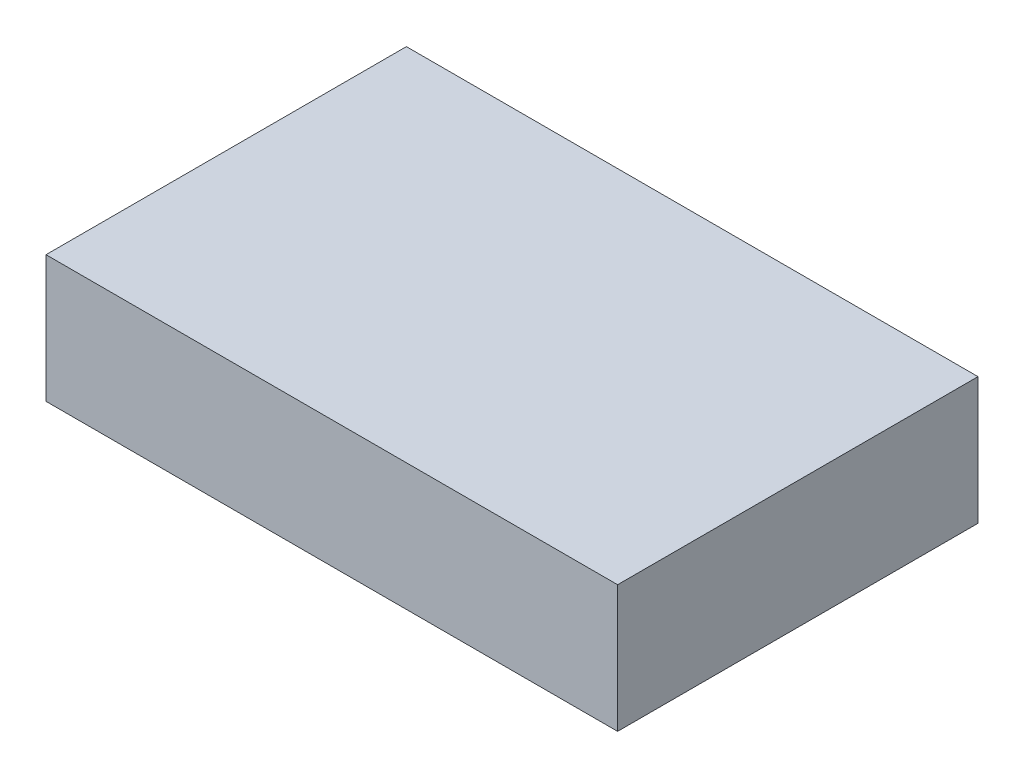
ISO-10303-21;
HEADER;
FILE_DESCRIPTION(('STEP AP214'),'2;1');
FILE_NAME('part.step','',(''),(''),'','','');
FILE_SCHEMA(('AUTOMOTIVE_DESIGN { 1 0 10303 214 1 1 1 1 }'));
ENDSEC;
DATA;
#1=APPLICATION_CONTEXT('core data for automotive mechanical design processes');
#2=APPLICATION_PROTOCOL_DEFINITION('international standard','automotive_design',2000,#1);
#3=PRODUCT_CONTEXT('',#1,'mechanical');
#4=PRODUCT('Part','Part','',(#3));
#5=PRODUCT_RELATED_PRODUCT_CATEGORY('part','',(#4));
#6=PRODUCT_DEFINITION_FORMATION('','',#4);
#7=PRODUCT_DEFINITION_CONTEXT('part definition',#1,'design');
#8=PRODUCT_DEFINITION('design','',#6,#7);
#9=PRODUCT_DEFINITION_SHAPE('','',#8);
#10=(LENGTH_UNIT() NAMED_UNIT(*) SI_UNIT(.MILLI.,.METRE.));
#11=(NAMED_UNIT(*) PLANE_ANGLE_UNIT() SI_UNIT($,.RADIAN.));
#12=(NAMED_UNIT(*) SI_UNIT($,.STERADIAN.) SOLID_ANGLE_UNIT());
#13=UNCERTAINTY_MEASURE_WITH_UNIT(LENGTH_MEASURE(1.E-05),#10,'distance_accuracy_value','');
#14=(GEOMETRIC_REPRESENTATION_CONTEXT(3) GLOBAL_UNCERTAINTY_ASSIGNED_CONTEXT((#13)) GLOBAL_UNIT_ASSIGNED_CONTEXT((#10,
#11,#12)) REPRESENTATION_CONTEXT('',''));
#15=CARTESIAN_POINT('',(0.,0.,0.));
#16=DIRECTION('',(0.,0.,1.));
#17=DIRECTION('',(1.,0.,0.));
#18=AXIS2_PLACEMENT_3D('',#15,#16,#17);
#19=CARTESIAN_POINT('',(29.025,12.9,18.3));
#20=DIRECTION('',(0.,0.,1.));
#21=DIRECTION('',(1.,0.,0.));
#22=AXIS2_PLACEMENT_3D('',#19,#20,#21);
#23=PLANE('',#22);
#24=DIRECTION('',(-1.,0.,0.));
#25=VECTOR('',#24,1.);
#26=CARTESIAN_POINT('',(29.025,0.,18.3));
#27=LINE('',#26,#25);
#28=CARTESIAN_POINT('',(29.025,0.,18.3));
#29=VERTEX_POINT('',#28);
#30=CARTESIAN_POINT('',(-29.025,0.,18.3));
#31=VERTEX_POINT('',#30);
#32=EDGE_CURVE('E108',#29,#31,#27,.T.);
#33=ORIENTED_EDGE('',*,*,#32,.F.);
#34=DIRECTION('',(0.,-1.,0.));
#35=VECTOR('',#34,1.);
#36=CARTESIAN_POINT('',(29.025,12.9,18.3));
#37=LINE('',#36,#35);
#38=CARTESIAN_POINT('',(29.025,12.9,18.3));
#39=VERTEX_POINT('',#38);
#40=EDGE_CURVE('E11',#39,#29,#37,.T.);
#41=ORIENTED_EDGE('',*,*,#40,.F.);
#42=DIRECTION('',(-1.,0.,0.));
#43=VECTOR('',#42,1.);
#44=CARTESIAN_POINT('',(29.025,12.9,18.3));
#45=LINE('',#44,#43);
#46=CARTESIAN_POINT('',(-29.025,12.9,18.3));
#47=VERTEX_POINT('',#46);
#48=EDGE_CURVE('E103',#39,#47,#45,.T.);
#49=ORIENTED_EDGE('',*,*,#48,.T.);
#50=DIRECTION('',(0.,-1.,0.));
#51=VECTOR('',#50,1.);
#52=CARTESIAN_POINT('',(-29.025,12.9,18.3));
#53=LINE('',#52,#51);
#54=EDGE_CURVE('E46',#47,#31,#53,.T.);
#55=ORIENTED_EDGE('',*,*,#54,.T.);
#56=EDGE_LOOP('',(#33,#41,#49,#55));
#57=FACE_BOUND('',#56,.T.);
#58=ADVANCED_FACE('F43',(#57),#23,.T.);
#59=CARTESIAN_POINT('',(29.025,12.9,18.3));
#60=DIRECTION('',(-1.,0.,0.));
#61=DIRECTION('',(0.,0.,1.));
#62=AXIS2_PLACEMENT_3D('',#59,#60,#61);
#63=PLANE('',#62);
#64=DIRECTION('',(0.,0.,-1.));
#65=VECTOR('',#64,1.);
#66=CARTESIAN_POINT('',(29.025,0.,18.3));
#67=LINE('',#66,#65);
#68=CARTESIAN_POINT('',(29.025,0.,-18.3));
#69=VERTEX_POINT('',#68);
#70=EDGE_CURVE('E76',#29,#69,#67,.T.);
#71=ORIENTED_EDGE('',*,*,#70,.T.);
#72=DIRECTION('',(0.,-1.,0.));
#73=VECTOR('',#72,1.);
#74=CARTESIAN_POINT('',(29.025,12.9,-18.3));
#75=LINE('',#74,#73);
#76=CARTESIAN_POINT('',(29.025,12.9,-18.3));
#77=VERTEX_POINT('',#76);
#78=EDGE_CURVE('E52',#77,#69,#75,.T.);
#79=ORIENTED_EDGE('',*,*,#78,.F.);
#80=DIRECTION('',(0.,0.,-1.));
#81=VECTOR('',#80,1.);
#82=CARTESIAN_POINT('',(29.025,12.9,18.3));
#83=LINE('',#82,#81);
#84=EDGE_CURVE('E93',#39,#77,#83,.T.);
#85=ORIENTED_EDGE('',*,*,#84,.F.);
#86=ORIENTED_EDGE('',*,*,#40,.T.);
#87=EDGE_LOOP('',(#71,#79,#85,#86));
#88=FACE_BOUND('',#87,.T.);
#89=ADVANCED_FACE('F118',(#88),#63,.F.);
#90=CARTESIAN_POINT('',(29.025,12.9,-18.3));
#91=DIRECTION('',(0.,0.,1.));
#92=DIRECTION('',(1.,0.,0.));
#93=AXIS2_PLACEMENT_3D('',#90,#91,#92);
#94=PLANE('',#93);
#95=DIRECTION('',(-1.,0.,0.));
#96=VECTOR('',#95,1.);
#97=CARTESIAN_POINT('',(29.025,0.,-18.3));
#98=LINE('',#97,#96);
#99=CARTESIAN_POINT('',(-29.025,0.,-18.3));
#100=VERTEX_POINT('',#99);
#101=EDGE_CURVE('E100',#69,#100,#98,.T.);
#102=ORIENTED_EDGE('',*,*,#101,.T.);
#103=DIRECTION('',(0.,-1.,0.));
#104=VECTOR('',#103,1.);
#105=CARTESIAN_POINT('',(-29.025,12.9,-18.3));
#106=LINE('',#105,#104);
#107=CARTESIAN_POINT('',(-29.025,12.9,-18.3));
#108=VERTEX_POINT('',#107);
#109=EDGE_CURVE('E97',#108,#100,#106,.T.);
#110=ORIENTED_EDGE('',*,*,#109,.F.);
#111=DIRECTION('',(-1.,0.,0.));
#112=VECTOR('',#111,1.);
#113=CARTESIAN_POINT('',(29.025,12.9,-18.3));
#114=LINE('',#113,#112);
#115=EDGE_CURVE('E88',#77,#108,#114,.T.);
#116=ORIENTED_EDGE('',*,*,#115,.F.);
#117=ORIENTED_EDGE('',*,*,#78,.T.);
#118=EDGE_LOOP('',(#102,#110,#116,#117));
#119=FACE_BOUND('',#118,.T.);
#120=ADVANCED_FACE('F98',(#119),#94,.F.);
#121=CARTESIAN_POINT('',(-29.025,12.9,18.3));
#122=DIRECTION('',(-1.,0.,0.));
#123=DIRECTION('',(0.,0.,1.));
#124=AXIS2_PLACEMENT_3D('',#121,#122,#123);
#125=PLANE('',#124);
#126=DIRECTION('',(0.,0.,-1.));
#127=VECTOR('',#126,1.);
#128=CARTESIAN_POINT('',(-29.025,0.,18.3));
#129=LINE('',#128,#127);
#130=EDGE_CURVE('E111',#31,#100,#129,.T.);
#131=ORIENTED_EDGE('',*,*,#130,.F.);
#132=ORIENTED_EDGE('',*,*,#54,.F.);
#133=DIRECTION('',(0.,0.,-1.));
#134=VECTOR('',#133,1.);
#135=CARTESIAN_POINT('',(-29.025,12.9,18.3));
#136=LINE('',#135,#134);
#137=EDGE_CURVE('E92',#47,#108,#136,.T.);
#138=ORIENTED_EDGE('',*,*,#137,.T.);
#139=ORIENTED_EDGE('',*,*,#109,.T.);
#140=EDGE_LOOP('',(#131,#132,#138,#139));
#141=FACE_BOUND('',#140,.T.);
#142=ADVANCED_FACE('F102',(#141),#125,.T.);
#143=CARTESIAN_POINT('',(0.,12.9,0.));
#144=DIRECTION('',(0.,-1.,0.));
#145=DIRECTION('',(0.,0.,-1.));
#146=AXIS2_PLACEMENT_3D('',#143,#144,#145);
#147=PLANE('',#146);
#148=ORIENTED_EDGE('',*,*,#48,.F.);
#149=ORIENTED_EDGE('',*,*,#84,.T.);
#150=ORIENTED_EDGE('',*,*,#115,.T.);
#151=ORIENTED_EDGE('',*,*,#137,.F.);
#152=EDGE_LOOP('',(#148,#149,#150,#151));
#153=FACE_BOUND('',#152,.T.);
#154=ADVANCED_FACE('F91',(#153),#147,.F.);
#155=CARTESIAN_POINT('',(0.,0.,0.));
#156=DIRECTION('',(0.,-1.,0.));
#157=DIRECTION('',(0.,0.,-1.));
#158=AXIS2_PLACEMENT_3D('',#155,#156,#157);
#159=PLANE('',#158);
#160=ORIENTED_EDGE('',*,*,#32,.T.);
#161=ORIENTED_EDGE('',*,*,#130,.T.);
#162=ORIENTED_EDGE('',*,*,#101,.F.);
#163=ORIENTED_EDGE('',*,*,#70,.F.);
#164=EDGE_LOOP('',(#160,#161,#162,#163));
#165=FACE_BOUND('',#164,.T.);
#166=ADVANCED_FACE('F116',(#165),#159,.T.);
#167=CLOSED_SHELL('',(#58,#89,#120,#142,#154,#166));
#168=MANIFOLD_SOLID_BREP('B2',#167);
#169=ADVANCED_BREP_SHAPE_REPRESENTATION('',(#18,#168),#14);
#170=SHAPE_DEFINITION_REPRESENTATION(#9,#169);
ENDSEC;
END-ISO-10303-21;
